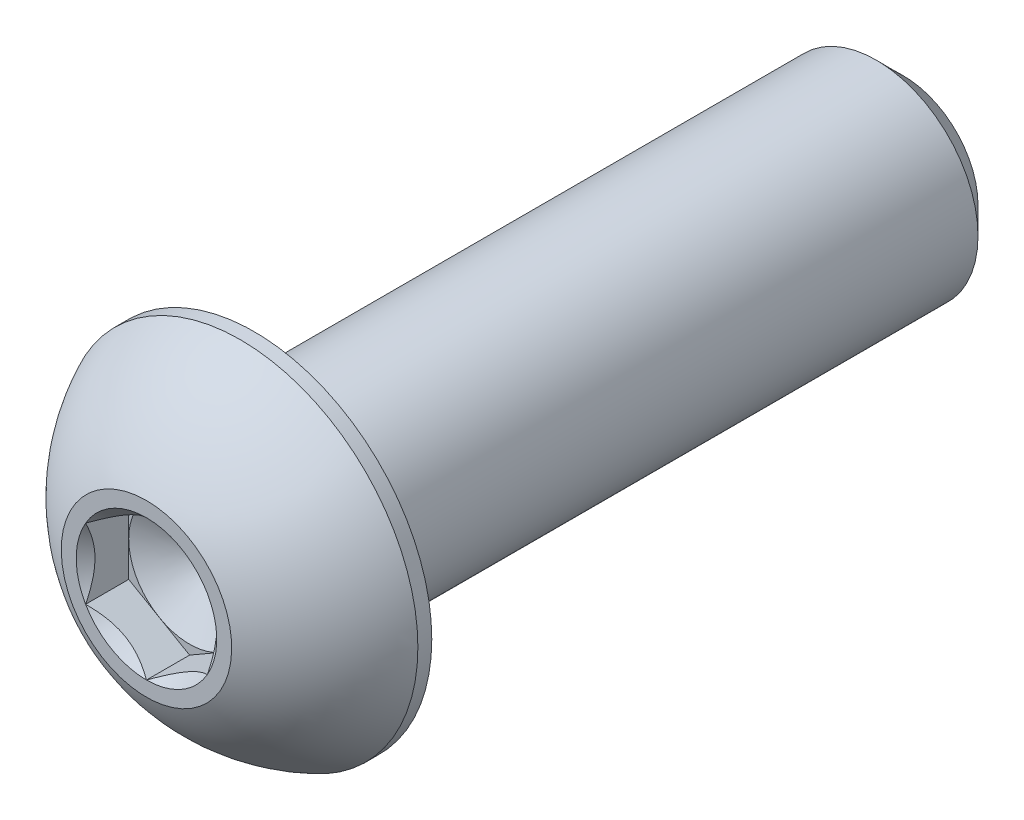
ISO-10303-21;
HEADER;
FILE_DESCRIPTION(('STEP AP214'),'2;1');
FILE_NAME('part.step','',(''),(''),'','','');
FILE_SCHEMA(('AUTOMOTIVE_DESIGN { 1 0 10303 214 1 1 1 1 }'));
ENDSEC;
DATA;
#1=APPLICATION_CONTEXT('core data for automotive mechanical design processes');
#2=APPLICATION_PROTOCOL_DEFINITION('international standard','automotive_design',2000,#1);
#3=PRODUCT_CONTEXT('',#1,'mechanical');
#4=PRODUCT('Part','Part','',(#3));
#5=PRODUCT_RELATED_PRODUCT_CATEGORY('part','',(#4));
#6=PRODUCT_DEFINITION_FORMATION('','',#4);
#7=PRODUCT_DEFINITION_CONTEXT('part definition',#1,'design');
#8=PRODUCT_DEFINITION('design','',#6,#7);
#9=PRODUCT_DEFINITION_SHAPE('','',#8);
#10=(LENGTH_UNIT() NAMED_UNIT(*) SI_UNIT(.MILLI.,.METRE.));
#11=(NAMED_UNIT(*) PLANE_ANGLE_UNIT() SI_UNIT($,.RADIAN.));
#12=(NAMED_UNIT(*) SI_UNIT($,.STERADIAN.) SOLID_ANGLE_UNIT());
#13=UNCERTAINTY_MEASURE_WITH_UNIT(LENGTH_MEASURE(1.E-05),#10,'distance_accuracy_value','');
#14=(GEOMETRIC_REPRESENTATION_CONTEXT(3) GLOBAL_UNCERTAINTY_ASSIGNED_CONTEXT((#13)) GLOBAL_UNIT_ASSIGNED_CONTEXT((#10,
#11,#12)) REPRESENTATION_CONTEXT('',''));
#15=CARTESIAN_POINT('',(0.,0.,0.));
#16=DIRECTION('',(0.,0.,1.));
#17=DIRECTION('',(1.,0.,0.));
#18=AXIS2_PLACEMENT_3D('',#15,#16,#17);
#19=CARTESIAN_POINT('',(0.,2.38125,14.8082));
#20=DIRECTION('',(0.,0.,-1.));
#21=DIRECTION('',(-1.,0.,0.));
#22=AXIS2_PLACEMENT_3D('',#19,#20,#21);
#23=PLANE('',#22);
#24=CARTESIAN_POINT('',(0.,0.,14.8082));
#25=DIRECTION('',(0.,0.,1.));
#26=DIRECTION('',(1.,0.,0.));
#27=AXIS2_PLACEMENT_3D('',#24,#25,#26);
#28=CIRCLE('',#27,3.33375);
#29=CARTESIAN_POINT('',(0.,3.33375,14.8082));
#30=VERTEX_POINT('',#29);
#31=EDGE_CURVE('E187',#30,#30,#28,.T.);
#32=ORIENTED_EDGE('',*,*,#31,.T.);
#33=EDGE_LOOP('',(#32));
#34=FACE_BOUND('',#33,.T.);
#35=CARTESIAN_POINT('',(0.,0.,14.8082));
#36=DIRECTION('',(0.,0.,1.));
#37=DIRECTION('',(1.,0.,0.));
#38=AXIS2_PLACEMENT_3D('',#35,#36,#37);
#39=CIRCLE('',#38,2.74963065701559);
#40=CARTESIAN_POINT('',(0.,2.74963065701559,14.8082));
#41=VERTEX_POINT('',#40);
#42=CARTESIAN_POINT('',(-2.38125,1.3748153285078,14.8082));
#43=VERTEX_POINT('',#42);
#44=EDGE_CURVE('E132',#41,#43,#39,.T.);
#45=ORIENTED_EDGE('',*,*,#44,.F.);
#46=CARTESIAN_POINT('',(0.,0.,14.8082));
#47=DIRECTION('',(0.,0.,1.));
#48=DIRECTION('',(1.,0.,0.));
#49=AXIS2_PLACEMENT_3D('',#46,#47,#48);
#50=CIRCLE('',#49,2.74963065701559);
#51=CARTESIAN_POINT('',(2.38125,1.37481532850779,14.8082));
#52=VERTEX_POINT('',#51);
#53=EDGE_CURVE('E112',#52,#41,#50,.T.);
#54=ORIENTED_EDGE('',*,*,#53,.F.);
#55=CARTESIAN_POINT('',(0.,0.,14.8082));
#56=DIRECTION('',(0.,0.,1.));
#57=DIRECTION('',(1.,0.,0.));
#58=AXIS2_PLACEMENT_3D('',#55,#56,#57);
#59=CIRCLE('',#58,2.74963065701559);
#60=CARTESIAN_POINT('',(2.38125,-1.37481532850779,14.8082));
#61=VERTEX_POINT('',#60);
#62=EDGE_CURVE('E130',#61,#52,#59,.T.);
#63=ORIENTED_EDGE('',*,*,#62,.F.);
#64=CARTESIAN_POINT('',(0.,0.,14.8082));
#65=DIRECTION('',(0.,0.,1.));
#66=DIRECTION('',(1.,0.,0.));
#67=AXIS2_PLACEMENT_3D('',#64,#65,#66);
#68=CIRCLE('',#67,2.74963065701559);
#69=CARTESIAN_POINT('',(0.,-2.74963065701559,14.8082));
#70=VERTEX_POINT('',#69);
#71=EDGE_CURVE('E153',#70,#61,#68,.T.);
#72=ORIENTED_EDGE('',*,*,#71,.F.);
#73=CARTESIAN_POINT('',(0.,0.,14.8082));
#74=DIRECTION('',(0.,0.,1.));
#75=DIRECTION('',(1.,0.,0.));
#76=AXIS2_PLACEMENT_3D('',#73,#74,#75);
#77=CIRCLE('',#76,2.74963065701559);
#78=CARTESIAN_POINT('',(-2.38125,-1.3748153285078,14.8082));
#79=VERTEX_POINT('',#78);
#80=EDGE_CURVE('E445',#79,#70,#77,.T.);
#81=ORIENTED_EDGE('',*,*,#80,.F.);
#82=CARTESIAN_POINT('',(0.,0.,14.8082));
#83=DIRECTION('',(0.,0.,1.));
#84=DIRECTION('',(1.,0.,0.));
#85=AXIS2_PLACEMENT_3D('',#82,#83,#84);
#86=CIRCLE('',#85,2.74963065701559);
#87=EDGE_CURVE('E451',#43,#79,#86,.T.);
#88=ORIENTED_EDGE('',*,*,#87,.F.);
#89=EDGE_LOOP('',(#45,#54,#63,#72,#81,#88));
#90=FACE_BOUND('',#89,.T.);
#91=ADVANCED_FACE('F41',(#34,#90),#23,.F.);
#92=CARTESIAN_POINT('',(0.,0.,-14.8082));
#93=DIRECTION('',(0.,0.,1.));
#94=DIRECTION('',(1.,0.,0.));
#95=AXIS2_PLACEMENT_3D('',#92,#93,#94);
#96=CONICAL_SURFACE('',#95,2.91676666666666,0.785398163397445);
#97=CARTESIAN_POINT('',(0.,0.,-13.7498666666667));
#98=DIRECTION('',(0.,0.,1.));
#99=DIRECTION('',(1.,0.,0.));
#100=AXIS2_PLACEMENT_3D('',#97,#98,#99);
#101=CIRCLE('',#100,3.9751);
#102=CARTESIAN_POINT('',(3.9751,0.,-13.7498666666667));
#103=VERTEX_POINT('',#102);
#104=EDGE_CURVE('E11',#103,#103,#101,.T.);
#105=ORIENTED_EDGE('',*,*,#104,.F.);
#106=EDGE_LOOP('',(#105));
#107=FACE_BOUND('',#106,.T.);
#108=CARTESIAN_POINT('',(0.,0.,-14.8082));
#109=DIRECTION('',(0.,0.,1.));
#110=DIRECTION('',(1.,0.,0.));
#111=AXIS2_PLACEMENT_3D('',#108,#109,#110);
#112=CIRCLE('',#111,2.91676666666666);
#113=CARTESIAN_POINT('',(2.91676666666666,0.,-14.8082));
#114=VERTEX_POINT('',#113);
#115=EDGE_CURVE('E183',#114,#114,#112,.T.);
#116=ORIENTED_EDGE('',*,*,#115,.T.);
#117=EDGE_LOOP('',(#116));
#118=FACE_BOUND('',#117,.T.);
#119=ADVANCED_FACE('F43',(#107,#118),#96,.T.);
#120=CARTESIAN_POINT('',(0.,0.,14.8082));
#121=DIRECTION('',(0.,0.,1.));
#122=DIRECTION('',(1.,0.,0.));
#123=AXIS2_PLACEMENT_3D('',#120,#121,#122);
#124=CYLINDRICAL_SURFACE('',#123,3.9751);
#125=CARTESIAN_POINT('',(0.,0.,10.5918));
#126=DIRECTION('',(0.,0.,1.));
#127=DIRECTION('',(1.,0.,0.));
#128=AXIS2_PLACEMENT_3D('',#125,#126,#127);
#129=CIRCLE('',#128,3.9751);
#130=CARTESIAN_POINT('',(3.9751,0.,10.5918));
#131=VERTEX_POINT('',#130);
#132=EDGE_CURVE('E49',#131,#131,#129,.T.);
#133=ORIENTED_EDGE('',*,*,#132,.F.);
#134=EDGE_LOOP('',(#133));
#135=FACE_BOUND('',#134,.T.);
#136=ORIENTED_EDGE('',*,*,#104,.T.);
#137=EDGE_LOOP('',(#136));
#138=FACE_BOUND('',#137,.T.);
#139=ADVANCED_FACE('F206',(#135,#138),#124,.T.);
#140=CARTESIAN_POINT('',(0.,6.9469,10.5918));
#141=DIRECTION('',(0.,0.,1.));
#142=DIRECTION('',(1.,0.,0.));
#143=AXIS2_PLACEMENT_3D('',#140,#141,#142);
#144=PLANE('',#143);
#145=CARTESIAN_POINT('',(0.,0.,10.5918));
#146=DIRECTION('',(0.,0.,1.));
#147=DIRECTION('',(1.,0.,0.));
#148=AXIS2_PLACEMENT_3D('',#145,#146,#147);
#149=CIRCLE('',#148,6.9469);
#150=CARTESIAN_POINT('',(6.9469,0.,10.5918));
#151=VERTEX_POINT('',#150);
#152=EDGE_CURVE('E197',#151,#151,#149,.T.);
#153=ORIENTED_EDGE('',*,*,#152,.F.);
#154=EDGE_LOOP('',(#153));
#155=FACE_BOUND('',#154,.T.);
#156=ORIENTED_EDGE('',*,*,#132,.T.);
#157=EDGE_LOOP('',(#156));
#158=FACE_BOUND('',#157,.T.);
#159=ADVANCED_FACE('F210',(#155,#158),#144,.F.);
#160=CARTESIAN_POINT('',(0.,0.,14.8082));
#161=DIRECTION('',(0.,0.,1.));
#162=DIRECTION('',(1.,0.,0.));
#163=AXIS2_PLACEMENT_3D('',#160,#161,#162);
#164=CYLINDRICAL_SURFACE('',#163,6.9469);
#165=CARTESIAN_POINT('',(0.,0.,11.1360857142857));
#166=DIRECTION('',(0.,0.,1.));
#167=DIRECTION('',(1.,0.,0.));
#168=AXIS2_PLACEMENT_3D('',#165,#166,#167);
#169=CIRCLE('',#168,6.9469);
#170=CARTESIAN_POINT('',(0.,6.9469,11.1360857142857));
#171=VERTEX_POINT('',#170);
#172=EDGE_CURVE('E194',#171,#171,#169,.T.);
#173=ORIENTED_EDGE('',*,*,#172,.F.);
#174=EDGE_LOOP('',(#173));
#175=FACE_BOUND('',#174,.T.);
#176=ORIENTED_EDGE('',*,*,#152,.T.);
#177=EDGE_LOOP('',(#176));
#178=FACE_BOUND('',#177,.T.);
#179=ADVANCED_FACE('F230',(#175,#178),#164,.T.);
#180=CARTESIAN_POINT('',(0.,0.,7.91435766074957));
#181=DIRECTION('',(0.,0.,1.));
#182=DIRECTION('',(0.,1.,0.));
#183=AXIS2_PLACEMENT_3D('',#180,#181,#182);
#184=SPHERICAL_SURFACE('',#183,7.65760741099606);
#185=CARTESIAN_POINT('',(0.,3.33375,14.8082));
#186=CARTESIAN_POINT('',(0.,3.38302135029023,14.784373284169));
#187=CARTESIAN_POINT('',(0.,3.43203717403164,14.7600181747289));
#188=CARTESIAN_POINT('',(0.,3.52953542836091,14.7102627440683));
#189=CARTESIAN_POINT('',(0.,3.57801785894876,14.6848624228478));
#190=CARTESIAN_POINT('',(0.,3.67442698691497,14.6330281440646));
#191=CARTESIAN_POINT('',(0.,3.72235368429333,14.6065941865018));
#192=CARTESIAN_POINT('',(0.,3.817629326969,14.5527048144032));
#193=CARTESIAN_POINT('',(0.,3.86497827226632,14.5252493998673));
#194=CARTESIAN_POINT('',(0.,3.95907663990594,14.4693297282752));
#195=CARTESIAN_POINT('',(0.,4.00582606224825,14.4408654712189));
#196=CARTESIAN_POINT('',(0.,4.09870389343264,14.3829412020653));
#197=CARTESIAN_POINT('',(0.,4.14483230227471,14.353481189968));
#198=CARTESIAN_POINT('',(0.,4.23644690014034,14.2935789535014));
#199=CARTESIAN_POINT('',(0.,4.2819330891639,14.263136729132));
#200=CARTESIAN_POINT('',(0.,4.37224233665281,14.2012840630941));
#201=CARTESIAN_POINT('',(0.,4.41706539511816,14.1698736214255));
#202=CARTESIAN_POINT('',(0.,4.50602777551311,14.1060989606913));
#203=CARTESIAN_POINT('',(0.,4.55016709744273,14.0737347416256));
#204=CARTESIAN_POINT('',(0.,4.63774171313888,14.0080674045151));
#205=CARTESIAN_POINT('',(0.,4.68117700690542,13.9747642864702));
#206=CARTESIAN_POINT('',(0.,4.76732359829586,13.9072344614351));
#207=CARTESIAN_POINT('',(0.,4.81003489591976,13.873007754445));
#208=CARTESIAN_POINT('',(0.,4.89471385988101,13.8036464861468));
#209=CARTESIAN_POINT('',(0.,4.93668152621836,13.7685119248389));
#210=CARTESIAN_POINT('',(0.,5.01985393432271,13.6973510998887));
#211=CARTESIAN_POINT('',(0.,5.0610586760897,13.6613248362464));
#212=CARTESIAN_POINT('',(0.,5.14268629249963,13.5883971685427));
#213=CARTESIAN_POINT('',(0.,5.18310916714257,13.5514957644813));
#214=CARTESIAN_POINT('',(0.,5.26315446618894,13.4768347801719));
#215=CARTESIAN_POINT('',(0.,5.30277689059236,13.4390751999239));
#216=CARTESIAN_POINT('',(0.,5.38120307402546,13.3627152219932));
#217=CARTESIAN_POINT('',(0.,5.42000683305513,13.3241148243103));
#218=CARTESIAN_POINT('',(0.,5.49677784696155,13.2460909568001));
#219=CARTESIAN_POINT('',(0.,5.53474510183829,13.2066674869727));
#220=CARTESIAN_POINT('',(0.,5.60982565321553,13.1270155988447));
#221=CARTESIAN_POINT('',(0.,5.64693894971602,13.086787180544));
#222=CARTESIAN_POINT('',(0.,5.72029452269731,13.0055438891899));
#223=CARTESIAN_POINT('',(0.,5.75653679917811,12.9645290161364));
#224=CARTESIAN_POINT('',(0.,5.82813367089999,12.8817316705442));
#225=CARTESIAN_POINT('',(0.,5.86348826614107,12.8399491980055));
#226=CARTESIAN_POINT('',(0.,5.93329352224632,12.7556358615898));
#227=CARTESIAN_POINT('',(0.,5.96774418311049,12.7131049977128));
#228=CARTESIAN_POINT('',(0.,6.03572573287969,12.6273144308161));
#229=CARTESIAN_POINT('',(0.,6.06925662178472,12.5840547277965));
#230=CARTESIAN_POINT('',(0.,6.13538321288805,12.4968263698702));
#231=CARTESIAN_POINT('',(0.,6.16797891508636,12.4528577149636));
#232=CARTESIAN_POINT('',(0.,6.23222014795407,12.3642316664386));
#233=CARTESIAN_POINT('',(0.,6.26386567862348,12.3195742728202));
#234=CARTESIAN_POINT('',(0.,6.32619202040916,12.2295912766658));
#235=CARTESIAN_POINT('',(0.,6.35687283152543,12.1842656741299));
#236=CARTESIAN_POINT('',(0.,6.41725562972736,12.0929670971458));
#237=CARTESIAN_POINT('',(0.,6.44695761681303,12.0469941226977));
#238=CARTESIAN_POINT('',(0.,6.50536911227987,11.9544219364152));
#239=CARTESIAN_POINT('',(0.,6.53407862066105,11.9078227245809));
#240=CARTESIAN_POINT('',(0.,6.59049196097422,11.8140194862722));
#241=CARTESIAN_POINT('',(0.,6.61819579290623,11.7668154597978));
#242=CARTESIAN_POINT('',(0.,6.67258504240674,11.6718242917758));
#243=CARTESIAN_POINT('',(0.,6.69927045997525,11.6240371502281));
#244=CARTESIAN_POINT('',(0.,6.75161062033667,11.5279017242615));
#245=CARTESIAN_POINT('',(0.,6.77726536312958,11.4795534398425));
#246=CARTESIAN_POINT('',(0.,6.82753235256829,11.3823179412581));
#247=CARTESIAN_POINT('',(0.,6.85214459921409,11.3334307270927));
#248=CARTESIAN_POINT('',(0.,6.90031538403797,11.2351398935073));
#249=CARTESIAN_POINT('',(0.,6.92387392221606,11.1857362740872));
#250=CARTESIAN_POINT('',(0.,6.9469,11.1360857142857));
#251=B_SPLINE_CURVE_WITH_KNOTS('',3,(#185,#186,#187,#188,#189,#190,#191,#192,#193,#194,#195,
#196,#197,#198,#199,#200,#201,#202,#203,#204,#205,#206,#207,#208,#209,#210,#211,#212,#213,#214,
#215,#216,#217,#218,#219,#220,#221,#222,#223,#224,#225,#226,#227,#228,#229,#230,#231,#232,#233,
#234,#235,#236,#237,#238,#239,#240,#241,#242,#243,#244,#245,#246,#247,#248,#249,#250),
.UNSPECIFIED.,.F.,.F.,(4,2,2,2,2,2,2,2,2,2,2,2,2,2,2,2,2,2,2,2,2,2,2,2,2,2,2,2,2,2,2,2,4),(0.,
0.164186998091728,0.328373996183455,0.492560994275183,0.65674799236691,0.820934990458635,
0.985121988550365,1.14930898664209,1.31349598473382,1.47768298282555,1.64186998091728,
1.806056979009,1.97024397710073,2.13443097519246,2.29861797328418,2.46280497137591,
2.62699196946764,2.79117896755937,2.9553659656511,3.11955296374282,3.28373996183455,
3.44792695992628,3.61211395801801,3.77630095610973,3.94048795420146,4.10467495229319,
4.26886195038492,4.43304894847664,4.59723594656837,4.7614229446601,4.92560994275183,
5.08979694084355,5.25398393893528),.UNSPECIFIED.);
#252=EDGE_CURVE('BSEAM218',#30,#171,#251,.T.);
#253=ORIENTED_EDGE('',*,*,#31,.F.);
#254=ORIENTED_EDGE('',*,*,#172,.T.);
#255=ORIENTED_EDGE('',*,*,#252,.T.);
#256=ORIENTED_EDGE('',*,*,#252,.F.);
#257=EDGE_LOOP('',(#253,#255,#254,#256));
#258=FACE_BOUND('',#257,.T.);
#259=ADVANCED_FACE('F218',(#258),#184,.T.);
#260=CARTESIAN_POINT('',(0.,2.91676666666666,-14.8082));
#261=DIRECTION('',(0.,0.,1.));
#262=DIRECTION('',(1.,0.,0.));
#263=AXIS2_PLACEMENT_3D('',#260,#261,#262);
#264=PLANE('',#263);
#265=ORIENTED_EDGE('',*,*,#115,.F.);
#266=EDGE_LOOP('',(#265));
#267=FACE_BOUND('',#266,.T.);
#268=ADVANCED_FACE('F219',(#267),#264,.F.);
#269=CARTESIAN_POINT('',(2.38125,1.3748153285078,14.8082));
#270=DIRECTION('',(-0.499999999999999,-0.866025403784439,0.));
#271=DIRECTION('',(0.866025403784439,-0.499999999999999,0.));
#272=AXIS2_PLACEMENT_3D('',#269,#270,#271);
#273=PLANE('',#272);
#274=CARTESIAN_POINT('',(2.38145,1.37469985845396,14.8083154773272));
#275=CARTESIAN_POINT('',(2.29959321762095,1.4219598937955,14.7610948967095));
#276=CARTESIAN_POINT('',(2.21636766622824,1.47001018829554,14.7166475752929));
#277=CARTESIAN_POINT('',(2.04666151916196,1.56799007798739,14.6352654569856));
#278=CARTESIAN_POINT('',(1.9601647826469,1.61792899209838,14.5983759430951));
#279=CARTESIAN_POINT('',(1.78574822599096,1.71862843803482,14.5351834131659));
#280=CARTESIAN_POINT('',(1.69787282881932,1.76936332224701,14.5087215587295));
#281=CARTESIAN_POINT('',(1.52018740592912,1.87195004898374,14.4679515156161));
#282=CARTESIAN_POINT('',(1.43038280881413,1.92379875730254,14.4536128915305));
#283=CARTESIAN_POINT('',(1.27561039686966,2.01315665100181,14.4406757847701));
#284=CARTESIAN_POINT('',(1.21084255103038,2.05055038423195,14.4387606046532));
#285=CARTESIAN_POINT('',(1.08141272066442,2.1252767316349,14.4419866227677));
#286=CARTESIAN_POINT('',(1.01675078120664,2.16260931978718,14.4471302948571));
#287=CARTESIAN_POINT('',(0.888037451422601,2.23692199538628,14.4641813108716));
#288=CARTESIAN_POINT('',(0.823986825765144,2.27390164135138,14.4760962213493));
#289=CARTESIAN_POINT('',(0.696993161094725,2.34722146783422,14.506035672352));
#290=CARTESIAN_POINT('',(0.634050037564173,2.38356169714822,14.5240597445184));
#291=CARTESIAN_POINT('',(0.472823849267816,2.47664568036154,14.5775688075524));
#292=CARTESIAN_POINT('',(0.375540508712158,2.53281224321902,14.6170874208722));
#293=CARTESIAN_POINT('',(0.232493937374429,2.61540021968751,14.6838003435508));
#294=CARTESIAN_POINT('',(0.185353711056034,2.64261664204209,14.7072402091113));
#295=CARTESIAN_POINT('',(0.0919464736333602,2.69654533571233,14.7562566766595));
#296=CARTESIAN_POINT('',(0.0456789475031768,2.72325790437833,14.7818319667669));
#297=CARTESIAN_POINT('',(-0.000200000000001534,2.74974612706943,14.8083154773272));
#298=B_SPLINE_CURVE_WITH_KNOTS('',3,(#274,#275,#276,#277,#278,#279,#280,#281,#282,#283,#284,
#285,#286,#287,#288,#289,#290,#291,#292,#293,#294,#295,#296,#297),.UNSPECIFIED.,.F.,.F.,(4,2,2,
2,2,2,2,2,2,2,2,4),(0.,0.31719661061195,0.636241461041221,0.950218950629225,1.26340583824126,
1.48752413747844,1.71172100167747,1.93616888974082,2.16059957440836,2.51709639744763,
2.69486147369099,2.87251813383154),.UNSPECIFIED.);
#299=EDGE_CURVE('E115',#52,#41,#298,.T.);
#300=ORIENTED_EDGE('',*,*,#299,.T.);
#301=DIRECTION('',(0.,0.,-1.));
#302=VECTOR('',#301,1.);
#303=CARTESIAN_POINT('',(0.,2.74963065701559,14.8082));
#304=LINE('',#303,#302);
#305=CARTESIAN_POINT('',(0.,2.74963065701559,13.12164));
#306=VERTEX_POINT('',#305);
#307=EDGE_CURVE('E176',#41,#306,#304,.T.);
#308=ORIENTED_EDGE('',*,*,#307,.T.);
#309=DIRECTION('',(-0.866025403784439,0.499999999999999,0.));
#310=VECTOR('',#309,1.);
#311=CARTESIAN_POINT('',(2.38125,1.3748153285078,13.12164));
#312=LINE('',#311,#310);
#313=CARTESIAN_POINT('',(1.190625,2.0622229927617,13.12164));
#314=VERTEX_POINT('',#313);
#315=EDGE_CURVE('E485',#314,#306,#312,.T.);
#316=ORIENTED_EDGE('',*,*,#315,.F.);
#317=CARTESIAN_POINT('',(2.38125,1.3748153285078,13.12164));
#318=VERTEX_POINT('',#317);
#319=EDGE_CURVE('E60',#318,#314,#312,.T.);
#320=ORIENTED_EDGE('',*,*,#319,.F.);
#321=DIRECTION('',(0.,0.,-1.));
#322=VECTOR('',#321,1.);
#323=CARTESIAN_POINT('',(2.38125,1.3748153285078,14.8082));
#324=LINE('',#323,#322);
#325=EDGE_CURVE('E149',#52,#318,#324,.T.);
#326=ORIENTED_EDGE('',*,*,#325,.F.);
#327=EDGE_LOOP('',(#300,#308,#316,#320,#326));
#328=FACE_BOUND('',#327,.T.);
#329=ADVANCED_FACE('F151',(#328),#273,.T.);
#330=CARTESIAN_POINT('',(0.,2.74963065701559,14.8082));
#331=DIRECTION('',(0.5,-0.866025403784438,0.));
#332=DIRECTION('',(0.866025403784439,0.5,0.));
#333=AXIS2_PLACEMENT_3D('',#330,#331,#332);
#334=PLANE('',#333);
#335=CARTESIAN_POINT('',(0.000199999999998581,2.74974612706943,14.8083154773272));
#336=CARTESIAN_POINT('',(-0.0816567823790514,2.70248609172789,14.7610948967095));
#337=CARTESIAN_POINT('',(-0.164882333771761,2.65443579722785,14.7166475752929));
#338=CARTESIAN_POINT('',(-0.33458848083804,2.556455907536,14.6352654569856));
#339=CARTESIAN_POINT('',(-0.421085217353102,2.50651699342501,14.5983759430951));
#340=CARTESIAN_POINT('',(-0.595501774009042,2.40581754748857,14.5351834131659));
#341=CARTESIAN_POINT('',(-0.683377171180674,2.35508266327639,14.5087215587295));
#342=CARTESIAN_POINT('',(-0.861062594070875,2.25249593653966,14.4679515156161));
#343=CARTESIAN_POINT('',(-0.95086719118587,2.20064722822085,14.4536128915305));
#344=CARTESIAN_POINT('',(-1.10563960313034,2.11128933452158,14.4406757847701));
#345=CARTESIAN_POINT('',(-1.17040744896962,2.07389560129144,14.4387606046532));
#346=CARTESIAN_POINT('',(-1.29983727933557,1.99916925388849,14.4419866227677));
#347=CARTESIAN_POINT('',(-1.36449921879335,1.96183666573622,14.4471302948571));
#348=CARTESIAN_POINT('',(-1.4932125485774,1.88752399013711,14.4641813108716));
#349=CARTESIAN_POINT('',(-1.55726317423485,1.85054434417201,14.4760962213493));
#350=CARTESIAN_POINT('',(-1.68425683890527,1.77722451768917,14.506035672352));
#351=CARTESIAN_POINT('',(-1.74719996243582,1.74088428837517,14.5240597445184));
#352=CARTESIAN_POINT('',(-1.90842615073218,1.64780030516185,14.5775688075524));
#353=CARTESIAN_POINT('',(-2.00570949128784,1.59163374230437,14.6170874208722));
#354=CARTESIAN_POINT('',(-2.14875606262557,1.50904576583588,14.6838003435508));
#355=CARTESIAN_POINT('',(-2.19589628894397,1.48182934348129,14.7072402091113));
#356=CARTESIAN_POINT('',(-2.28930352636664,1.42790064981105,14.7562566766595));
#357=CARTESIAN_POINT('',(-2.33557105249682,1.40118808114505,14.7818319667669));
#358=CARTESIAN_POINT('',(-2.38145,1.37469985845396,14.8083154773272));
#359=B_SPLINE_CURVE_WITH_KNOTS('',3,(#335,#336,#337,#338,#339,#340,#341,#342,#343,#344,#345,
#346,#347,#348,#349,#350,#351,#352,#353,#354,#355,#356,#357,#358),.UNSPECIFIED.,.F.,.F.,(4,2,2,
2,2,2,2,2,2,2,2,4),(0.,0.317196610611948,0.636241461041217,0.95021895062922,1.26340583824126,
1.48752413747844,1.71172100167747,1.93616888974082,2.16059957440836,2.51709639744763,
2.69486147369099,2.87251813383154),.UNSPECIFIED.);
#360=EDGE_CURVE('E466',#41,#43,#359,.T.);
#361=ORIENTED_EDGE('',*,*,#360,.T.);
#362=DIRECTION('',(0.,0.,-1.));
#363=VECTOR('',#362,1.);
#364=CARTESIAN_POINT('',(-2.38125,1.3748153285078,14.8082));
#365=LINE('',#364,#363);
#366=CARTESIAN_POINT('',(-2.38125,1.3748153285078,13.12164));
#367=VERTEX_POINT('',#366);
#368=EDGE_CURVE('E173',#43,#367,#365,.T.);
#369=ORIENTED_EDGE('',*,*,#368,.T.);
#370=DIRECTION('',(-0.866025403784438,-0.5,0.));
#371=VECTOR('',#370,1.);
#372=CARTESIAN_POINT('',(0.,2.74963065701559,13.12164));
#373=LINE('',#372,#371);
#374=CARTESIAN_POINT('',(-1.190625,2.06222299276169,13.12164));
#375=VERTEX_POINT('',#374);
#376=EDGE_CURVE('E490',#375,#367,#373,.T.);
#377=ORIENTED_EDGE('',*,*,#376,.F.);
#378=EDGE_CURVE('E486',#306,#375,#373,.T.);
#379=ORIENTED_EDGE('',*,*,#378,.F.);
#380=ORIENTED_EDGE('',*,*,#307,.F.);
#381=EDGE_LOOP('',(#361,#369,#377,#379,#380));
#382=FACE_BOUND('',#381,.T.);
#383=ADVANCED_FACE('F222',(#382),#334,.T.);
#384=CARTESIAN_POINT('',(-2.38125,1.3748153285078,14.8082));
#385=DIRECTION('',(1.,0.,0.));
#386=DIRECTION('',(0.,0.,-1.));
#387=AXIS2_PLACEMENT_3D('',#384,#385,#386);
#388=PLANE('',#387);
#389=CARTESIAN_POINT('',(-2.38125,-2.68093697563405,15.6443432663965));
#390=CARTESIAN_POINT('',(-2.38125,-2.61537673823883,15.5953377465174));
#391=CARTESIAN_POINT('',(-2.38125,-2.5494428959396,15.5468241515259));
#392=CARTESIAN_POINT('',(-2.38125,-2.41668286712078,15.450998463343));
#393=CARTESIAN_POINT('',(-2.38125,-2.34985645441489,15.4036866838688));
#394=CARTESIAN_POINT('',(-2.38125,-2.21467778506723,15.3101465530956));
#395=CARTESIAN_POINT('',(-2.38125,-2.14631771455877,15.263929448702));
#396=CARTESIAN_POINT('',(-2.38125,-2.00842861240695,15.1732822820154));
#397=CARTESIAN_POINT('',(-2.38125,-1.93889966505844,15.1288520916344));
#398=CARTESIAN_POINT('',(-2.38125,-1.79468056782077,15.0398168397088));
#399=CARTESIAN_POINT('',(-2.38125,-1.7199148963968,14.9953327509229));
#400=CARTESIAN_POINT('',(-2.38125,-1.56866640609358,14.9093937948604));
#401=CARTESIAN_POINT('',(-2.38125,-1.4921832926984,14.8679394524072));
#402=CARTESIAN_POINT('',(-2.38125,-1.26025763131786,14.7494620510276));
#403=CARTESIAN_POINT('',(-2.38125,-1.10179241401632,14.6779747218281));
#404=CARTESIAN_POINT('',(-2.38125,-0.863378822320742,14.5905371160492));
#405=CARTESIAN_POINT('',(-2.38125,-0.786812117689916,14.5653432254707));
#406=CARTESIAN_POINT('',(-2.38125,-0.631880652104271,14.521110848047));
#407=CARTESIAN_POINT('',(-2.38125,-0.553515762563794,14.502072802876));
#408=CARTESIAN_POINT('',(-2.38125,-0.396740444727931,14.4714422086397));
#409=CARTESIAN_POINT('',(-2.38125,-0.318354592421681,14.4597257304419));
#410=CARTESIAN_POINT('',(-2.38125,-0.160811391513107,14.4439572505446));
#411=CARTESIAN_POINT('',(-2.38125,-0.081654165488202,14.4399040504268));
#412=CARTESIAN_POINT('',(-2.38125,0.074060292385675,14.4397399931148));
#413=CARTESIAN_POINT('',(-2.38125,0.150617362449071,14.4433721582242));
#414=CARTESIAN_POINT('',(-2.38125,0.303045058644073,14.4578250392574));
#415=CARTESIAN_POINT('',(-2.38125,0.378915615534023,14.4686464722762));
#416=CARTESIAN_POINT('',(-2.38125,0.530705497402317,14.4970811808727));
#417=CARTESIAN_POINT('',(-2.38125,0.606603253729553,14.5148079792297));
#418=CARTESIAN_POINT('',(-2.38125,0.7567446999479,14.5561296417724));
#419=CARTESIAN_POINT('',(-2.38125,0.830988547951422,14.5797239423834));
#420=CARTESIAN_POINT('',(-2.38125,1.06763086976207,14.6637213761345));
#421=CARTESIAN_POINT('',(-2.38125,1.22660579709034,14.7338089551137));
#422=CARTESIAN_POINT('',(-2.38125,1.45921559038166,14.8505529104409));
#423=CARTESIAN_POINT('',(-2.38125,1.53592336227363,14.8914960087655));
#424=CARTESIAN_POINT('',(-2.38125,1.68759115763186,14.9765080130968));
#425=CARTESIAN_POINT('',(-2.38125,1.76255149716754,15.0205763479007));
#426=CARTESIAN_POINT('',(-2.38125,1.90722078640504,15.1089350758827));
#427=CARTESIAN_POINT('',(-2.38125,1.9770047991093,15.153103977698));
#428=CARTESIAN_POINT('',(-2.38125,2.1153770860433,15.2432859170887));
#429=CARTESIAN_POINT('',(-2.38125,2.18396526865549,15.2892990950785));
#430=CARTESIAN_POINT('',(-2.38125,2.31954185261313,15.3824549535719));
#431=CARTESIAN_POINT('',(-2.38125,2.38653874938857,15.4295853213314));
#432=CARTESIAN_POINT('',(-2.38125,2.51961928244701,15.5250816363799));
#433=CARTESIAN_POINT('',(-2.38125,2.5857031643215,15.5734472410235));
#434=CARTESIAN_POINT('',(-2.38125,2.65140534249806,15.6223176299328));
#435=B_SPLINE_CURVE_WITH_KNOTS('',3,(#389,#390,#391,#392,#393,#394,#395,#396,#397,#398,#399,
#400,#401,#402,#403,#404,#405,#406,#407,#408,#409,#410,#411,#412,#413,#414,#415,#416,#417,#418,
#419,#420,#421,#422,#423,#424,#425,#426,#427,#428,#429,#430,#431,#432,#433,#434),.UNSPECIFIED.,
.F.,.F.,(4,2,2,2,2,2,2,2,2,2,2,2,2,2,2,2,2,2,2,2,2,2,4),(0.,0.245559397749502,0.49118225005154,
0.738709851919414,0.986219678990053,1.24714085173299,1.50810711556283,2.02809815735129,
2.26971433296159,2.51134784037998,2.74877188520499,2.98615879750397,3.21573376787964,
3.44533164068965,3.67887518141291,3.9123962988927,4.43198274993457,4.69281495793137,
4.95359961558862,5.20133278619984,5.44908485401467,5.6948110258164,5.94046975988132),.UNSPECIFIED.);
#436=EDGE_CURVE('E462',#43,#79,#435,.F.);
#437=ORIENTED_EDGE('',*,*,#436,.T.);
#438=DIRECTION('',(0.,0.,-1.));
#439=VECTOR('',#438,1.);
#440=CARTESIAN_POINT('',(-2.38125,-1.3748153285078,14.8082));
#441=LINE('',#440,#439);
#442=CARTESIAN_POINT('',(-2.38125,-1.3748153285078,13.12164));
#443=VERTEX_POINT('',#442);
#444=EDGE_CURVE('E168',#79,#443,#441,.T.);
#445=ORIENTED_EDGE('',*,*,#444,.T.);
#446=DIRECTION('',(0.,-1.,0.));
#447=VECTOR('',#446,1.);
#448=CARTESIAN_POINT('',(-2.38125,1.3748153285078,13.12164));
#449=LINE('',#448,#447);
#450=CARTESIAN_POINT('',(-2.38125,0.,13.12164));
#451=VERTEX_POINT('',#450);
#452=EDGE_CURVE('E491',#451,#443,#449,.T.);
#453=ORIENTED_EDGE('',*,*,#452,.F.);
#454=EDGE_CURVE('E495',#367,#451,#449,.T.);
#455=ORIENTED_EDGE('',*,*,#454,.F.);
#456=ORIENTED_EDGE('',*,*,#368,.F.);
#457=EDGE_LOOP('',(#437,#445,#453,#455,#456));
#458=FACE_BOUND('',#457,.T.);
#459=ADVANCED_FACE('F331',(#458),#388,.T.);
#460=CARTESIAN_POINT('',(-2.38125,-1.3748153285078,14.8082));
#461=DIRECTION('',(0.499999999999999,0.866025403784439,0.));
#462=DIRECTION('',(-0.866025403784439,0.499999999999999,0.));
#463=AXIS2_PLACEMENT_3D('',#460,#461,#462);
#464=PLANE('',#463);
#465=CARTESIAN_POINT('',(-2.38145,-1.37469985845396,14.8083154773272));
#466=CARTESIAN_POINT('',(-2.29959321762095,-1.4219598937955,14.7610948967095));
#467=CARTESIAN_POINT('',(-2.21636766622824,-1.47001018829554,14.7166475752929));
#468=CARTESIAN_POINT('',(-2.04666151916196,-1.56799007798739,14.6352654569856));
#469=CARTESIAN_POINT('',(-1.9601647826469,-1.61792899209838,14.5983759430951));
#470=CARTESIAN_POINT('',(-1.78574822599096,-1.71862843803482,14.5351834131659));
#471=CARTESIAN_POINT('',(-1.69787282881932,-1.76936332224701,14.5087215587295));
#472=CARTESIAN_POINT('',(-1.52018740592912,-1.87195004898373,14.4679515156161));
#473=CARTESIAN_POINT('',(-1.43038280881413,-1.92379875730254,14.4536128915305));
#474=CARTESIAN_POINT('',(-1.27561039686966,-2.01315665100181,14.4406757847701));
#475=CARTESIAN_POINT('',(-1.21084255103038,-2.05055038423195,14.4387606046532));
#476=CARTESIAN_POINT('',(-1.08141272066443,-2.1252767316349,14.4419866227677));
#477=CARTESIAN_POINT('',(-1.01675078120664,-2.16260931978717,14.4471302948571));
#478=CARTESIAN_POINT('',(-0.888037451422603,-2.23692199538628,14.4641813108716));
#479=CARTESIAN_POINT('',(-0.823986825765146,-2.27390164135138,14.4760962213493));
#480=CARTESIAN_POINT('',(-0.696993161094727,-2.34722146783422,14.506035672352));
#481=CARTESIAN_POINT('',(-0.634050037564176,-2.38356169714822,14.5240597445184));
#482=CARTESIAN_POINT('',(-0.472823849267818,-2.47664568036154,14.5775688075524));
#483=CARTESIAN_POINT('',(-0.37554050871216,-2.53281224321902,14.6170874208722));
#484=CARTESIAN_POINT('',(-0.23249393737443,-2.61540021968751,14.6838003435508));
#485=CARTESIAN_POINT('',(-0.185353711056035,-2.64261664204209,14.7072402091113));
#486=CARTESIAN_POINT('',(-0.0919464736333604,-2.69654533571233,14.7562566766595));
#487=CARTESIAN_POINT('',(-0.0456789475031769,-2.72325790437833,14.7818319667669));
#488=CARTESIAN_POINT('',(0.000200000000001864,-2.74974612706943,14.8083154773272));
#489=B_SPLINE_CURVE_WITH_KNOTS('',3,(#465,#466,#467,#468,#469,#470,#471,#472,#473,#474,#475,
#476,#477,#478,#479,#480,#481,#482,#483,#484,#485,#486,#487,#488),.UNSPECIFIED.,.F.,.F.,(4,2,2,
2,2,2,2,2,2,2,2,4),(0.,0.31719661061195,0.63624146104122,0.950218950629223,1.26340583824126,
1.48752413747844,1.71172100167747,1.93616888974082,2.16059957440836,2.51709639744763,
2.69486147369099,2.87251813383154),.UNSPECIFIED.);
#490=EDGE_CURVE('E443',#79,#70,#489,.T.);
#491=ORIENTED_EDGE('',*,*,#490,.T.);
#492=DIRECTION('',(0.,0.,-1.));
#493=VECTOR('',#492,1.);
#494=CARTESIAN_POINT('',(0.,-2.74963065701559,14.8082));
#495=LINE('',#494,#493);
#496=CARTESIAN_POINT('',(0.,-2.74963065701559,13.12164));
#497=VERTEX_POINT('',#496);
#498=EDGE_CURVE('E159',#70,#497,#495,.T.);
#499=ORIENTED_EDGE('',*,*,#498,.T.);
#500=DIRECTION('',(0.866025403784439,-0.499999999999999,0.));
#501=VECTOR('',#500,1.);
#502=CARTESIAN_POINT('',(-2.38125,-1.3748153285078,13.12164));
#503=LINE('',#502,#501);
#504=CARTESIAN_POINT('',(-1.190625,-2.0622229927617,13.12164));
#505=VERTEX_POINT('',#504);
#506=EDGE_CURVE('E496',#505,#497,#503,.T.);
#507=ORIENTED_EDGE('',*,*,#506,.F.);
#508=EDGE_CURVE('E500',#443,#505,#503,.T.);
#509=ORIENTED_EDGE('',*,*,#508,.F.);
#510=ORIENTED_EDGE('',*,*,#444,.F.);
#511=EDGE_LOOP('',(#491,#499,#507,#509,#510));
#512=FACE_BOUND('',#511,.T.);
#513=ADVANCED_FACE('F345',(#512),#464,.T.);
#514=CARTESIAN_POINT('',(0.,-2.74963065701559,14.8082));
#515=DIRECTION('',(-0.5,0.866025403784438,0.));
#516=DIRECTION('',(-0.866025403784439,-0.5,0.));
#517=AXIS2_PLACEMENT_3D('',#514,#515,#516);
#518=PLANE('',#517);
#519=CARTESIAN_POINT('',(-0.000199999999997846,-2.74974612706943,14.8083154773272));
#520=CARTESIAN_POINT('',(0.0816567823790523,-2.70248609172789,14.7610948967095));
#521=CARTESIAN_POINT('',(0.164882333771762,-2.65443579722785,14.7166475752929));
#522=CARTESIAN_POINT('',(0.334588480838041,-2.556455907536,14.6352654569856));
#523=CARTESIAN_POINT('',(0.421085217353104,-2.50651699342501,14.5983759430951));
#524=CARTESIAN_POINT('',(0.595501774009043,-2.40581754748857,14.5351834131659));
#525=CARTESIAN_POINT('',(0.683377171180676,-2.35508266327639,14.5087215587295));
#526=CARTESIAN_POINT('',(0.861062594070877,-2.25249593653966,14.4679515156161));
#527=CARTESIAN_POINT('',(0.950867191185872,-2.20064722822085,14.4536128915305));
#528=CARTESIAN_POINT('',(1.10563960313034,-2.11128933452158,14.4406757847701));
#529=CARTESIAN_POINT('',(1.17040744896962,-2.07389560129144,14.4387606046532));
#530=CARTESIAN_POINT('',(1.29983727933557,-1.99916925388849,14.4419866227677));
#531=CARTESIAN_POINT('',(1.36449921879336,-1.96183666573622,14.4471302948571));
#532=CARTESIAN_POINT('',(1.4932125485774,-1.88752399013711,14.4641813108716));
#533=CARTESIAN_POINT('',(1.55726317423485,-1.85054434417201,14.4760962213493));
#534=CARTESIAN_POINT('',(1.68425683890527,-1.77722451768917,14.506035672352));
#535=CARTESIAN_POINT('',(1.74719996243582,-1.74088428837517,14.5240597445185));
#536=CARTESIAN_POINT('',(1.90842615073218,-1.64780030516185,14.5775688075524));
#537=CARTESIAN_POINT('',(2.00570949128784,-1.59163374230437,14.6170874208722));
#538=CARTESIAN_POINT('',(2.14875606262557,-1.50904576583588,14.6838003435508));
#539=CARTESIAN_POINT('',(2.19589628894397,-1.48182934348129,14.7072402091113));
#540=CARTESIAN_POINT('',(2.28930352636664,-1.42790064981105,14.7562566766595));
#541=CARTESIAN_POINT('',(2.33557105249682,-1.40118808114506,14.7818319667669));
#542=CARTESIAN_POINT('',(2.38145,-1.37469985845396,14.8083154773272));
#543=B_SPLINE_CURVE_WITH_KNOTS('',3,(#519,#520,#521,#522,#523,#524,#525,#526,#527,#528,#529,
#530,#531,#532,#533,#534,#535,#536,#537,#538,#539,#540,#541,#542),.UNSPECIFIED.,.F.,.F.,(4,2,2,
2,2,2,2,2,2,2,2,4),(0.,0.317196610611948,0.636241461041217,0.95021895062922,1.26340583824126,
1.48752413747844,1.71172100167747,1.93616888974082,2.16059957440836,2.51709639744763,
2.69486147369099,2.87251813383154),.UNSPECIFIED.);
#544=EDGE_CURVE('E431',#70,#61,#543,.T.);
#545=ORIENTED_EDGE('',*,*,#544,.T.);
#546=DIRECTION('',(0.,0.,-1.));
#547=VECTOR('',#546,1.);
#548=CARTESIAN_POINT('',(2.38125,-1.3748153285078,14.8082));
#549=LINE('',#548,#547);
#550=CARTESIAN_POINT('',(2.38125,-1.3748153285078,13.12164));
#551=VERTEX_POINT('',#550);
#552=EDGE_CURVE('E148',#61,#551,#549,.T.);
#553=ORIENTED_EDGE('',*,*,#552,.T.);
#554=DIRECTION('',(0.866025403784438,0.5,0.));
#555=VECTOR('',#554,1.);
#556=CARTESIAN_POINT('',(0.,-2.74963065701559,13.12164));
#557=LINE('',#556,#555);
#558=CARTESIAN_POINT('',(1.190625,-2.0622229927617,13.12164));
#559=VERTEX_POINT('',#558);
#560=EDGE_CURVE('E499',#559,#551,#557,.T.);
#561=ORIENTED_EDGE('',*,*,#560,.F.);
#562=EDGE_CURVE('E501',#497,#559,#557,.T.);
#563=ORIENTED_EDGE('',*,*,#562,.F.);
#564=ORIENTED_EDGE('',*,*,#498,.F.);
#565=EDGE_LOOP('',(#545,#553,#561,#563,#564));
#566=FACE_BOUND('',#565,.T.);
#567=ADVANCED_FACE('F351',(#566),#518,.T.);
#568=CARTESIAN_POINT('',(2.38125,-1.3748153285078,14.8082));
#569=DIRECTION('',(-1.,0.,0.));
#570=DIRECTION('',(0.,-1.,0.));
#571=AXIS2_PLACEMENT_3D('',#568,#569,#570);
#572=PLANE('',#571);
#573=CARTESIAN_POINT('',(2.38125,-2.68093697563405,15.6443432663965));
#574=CARTESIAN_POINT('',(2.38125,-2.61537673823883,15.5953377465174));
#575=CARTESIAN_POINT('',(2.38125,-2.5494428959396,15.5468241515259));
#576=CARTESIAN_POINT('',(2.38125,-2.41668286712078,15.450998463343));
#577=CARTESIAN_POINT('',(2.38125,-2.34985645441489,15.4036866838688));
#578=CARTESIAN_POINT('',(2.38125,-2.21467778506723,15.3101465530956));
#579=CARTESIAN_POINT('',(2.38125,-2.14631771455877,15.263929448702));
#580=CARTESIAN_POINT('',(2.38125,-2.00842861240695,15.1732822820154));
#581=CARTESIAN_POINT('',(2.38125,-1.93889966505843,15.1288520916344));
#582=CARTESIAN_POINT('',(2.38125,-1.79468056782076,15.0398168397088));
#583=CARTESIAN_POINT('',(2.38125,-1.7199148963968,14.9953327509229));
#584=CARTESIAN_POINT('',(2.38125,-1.56866640609358,14.9093937948604));
#585=CARTESIAN_POINT('',(2.38125,-1.4921832926984,14.8679394524072));
#586=CARTESIAN_POINT('',(2.38125,-1.26025763131786,14.7494620510276));
#587=CARTESIAN_POINT('',(2.38125,-1.10179241401632,14.6779747218281));
#588=CARTESIAN_POINT('',(2.38125,-0.86337882232074,14.5905371160492));
#589=CARTESIAN_POINT('',(2.38125,-0.786812117689913,14.5653432254707));
#590=CARTESIAN_POINT('',(2.38125,-0.631880652104268,14.521110848047));
#591=CARTESIAN_POINT('',(2.38125,-0.55351576256379,14.502072802876));
#592=CARTESIAN_POINT('',(2.38125,-0.396740444727927,14.4714422086397));
#593=CARTESIAN_POINT('',(2.38125,-0.318354592421678,14.4597257304419));
#594=CARTESIAN_POINT('',(2.38125,-0.160811391513103,14.4439572505446));
#595=CARTESIAN_POINT('',(2.38125,-0.0816541654881983,14.4399040504268));
#596=CARTESIAN_POINT('',(2.38125,0.0740602923856784,14.4397399931148));
#597=CARTESIAN_POINT('',(2.38125,0.150617362449074,14.4433721582242));
#598=CARTESIAN_POINT('',(2.38125,0.303045058644076,14.4578250392574));
#599=CARTESIAN_POINT('',(2.38125,0.378915615534026,14.4686464722762));
#600=CARTESIAN_POINT('',(2.38125,0.53070549740232,14.4970811808727));
#601=CARTESIAN_POINT('',(2.38125,0.606603253729556,14.5148079792297));
#602=CARTESIAN_POINT('',(2.38125,0.756744699947902,14.5561296417724));
#603=CARTESIAN_POINT('',(2.38125,0.830988547951424,14.5797239423834));
#604=CARTESIAN_POINT('',(2.38125,1.06763086976207,14.6637213761345));
#605=CARTESIAN_POINT('',(2.38125,1.22660579709035,14.7338089551137));
#606=CARTESIAN_POINT('',(2.38125,1.45921559038166,14.8505529104409));
#607=CARTESIAN_POINT('',(2.38125,1.53592336227363,14.8914960087655));
#608=CARTESIAN_POINT('',(2.38125,1.68759115763186,14.9765080130968));
#609=CARTESIAN_POINT('',(2.38125,1.76255149716754,15.0205763479007));
#610=CARTESIAN_POINT('',(2.38125,1.90722078640504,15.1089350758827));
#611=CARTESIAN_POINT('',(2.38125,1.9770047991093,15.153103977698));
#612=CARTESIAN_POINT('',(2.38125,2.1153770860433,15.2432859170887));
#613=CARTESIAN_POINT('',(2.38125,2.18396526865549,15.2892990950785));
#614=CARTESIAN_POINT('',(2.38125,2.31954185261314,15.3824549535719));
#615=CARTESIAN_POINT('',(2.38125,2.38653874938857,15.4295853213314));
#616=CARTESIAN_POINT('',(2.38125,2.51961928244702,15.5250816363799));
#617=CARTESIAN_POINT('',(2.38125,2.58570316432151,15.5734472410235));
#618=CARTESIAN_POINT('',(2.38125,2.65140534249807,15.6223176299328));
#619=B_SPLINE_CURVE_WITH_KNOTS('',3,(#573,#574,#575,#576,#577,#578,#579,#580,#581,#582,#583,
#584,#585,#586,#587,#588,#589,#590,#591,#592,#593,#594,#595,#596,#597,#598,#599,#600,#601,#602,
#603,#604,#605,#606,#607,#608,#609,#610,#611,#612,#613,#614,#615,#616,#617,#618),.UNSPECIFIED.,
.F.,.F.,(4,2,2,2,2,2,2,2,2,2,2,2,2,2,2,2,2,2,2,2,2,2,4),(0.,0.245559397749501,0.491182250051538,
0.738709851919414,0.986219678990051,1.24714085173299,1.50810711556282,2.02809815735129,
2.26971433296159,2.51134784037998,2.74877188520499,2.98615879750397,3.21573376787964,
3.44533164068965,3.67887518141291,3.91239629889269,4.43198274993457,4.69281495793137,
4.95359961558861,5.20133278619984,5.44908485401467,5.6948110258164,5.94046975988132),.UNSPECIFIED.);
#620=EDGE_CURVE('E139',#61,#52,#619,.T.);
#621=ORIENTED_EDGE('',*,*,#620,.T.);
#622=ORIENTED_EDGE('',*,*,#325,.T.);
#623=DIRECTION('',(0.,1.,0.));
#624=VECTOR('',#623,1.);
#625=CARTESIAN_POINT('',(2.38125,-1.3748153285078,13.12164));
#626=LINE('',#625,#624);
#627=CARTESIAN_POINT('',(2.38125,0.,13.12164));
#628=VERTEX_POINT('',#627);
#629=EDGE_CURVE('E164',#628,#318,#626,.T.);
#630=ORIENTED_EDGE('',*,*,#629,.F.);
#631=EDGE_CURVE('E154',#551,#628,#626,.T.);
#632=ORIENTED_EDGE('',*,*,#631,.F.);
#633=ORIENTED_EDGE('',*,*,#552,.F.);
#634=EDGE_LOOP('',(#621,#622,#630,#632,#633));
#635=FACE_BOUND('',#634,.T.);
#636=ADVANCED_FACE('F141',(#635),#572,.T.);
#637=CARTESIAN_POINT('',(0.,0.,13.12164));
#638=DIRECTION('',(0.,0.,1.));
#639=DIRECTION('',(1.,0.,0.));
#640=AXIS2_PLACEMENT_3D('',#637,#638,#639);
#641=PLANE('',#640);
#642=CARTESIAN_POINT('',(0.,0.,13.12164));
#643=DIRECTION('',(0.,0.,1.));
#644=DIRECTION('',(1.,0.,0.));
#645=AXIS2_PLACEMENT_3D('',#642,#643,#644);
#646=CIRCLE('',#645,2.38125);
#647=EDGE_CURVE('E184',#559,#628,#646,.T.);
#648=ORIENTED_EDGE('',*,*,#647,.F.);
#649=ORIENTED_EDGE('',*,*,#560,.T.);
#650=ORIENTED_EDGE('',*,*,#631,.T.);
#651=EDGE_LOOP('',(#648,#649,#650));
#652=FACE_BOUND('',#651,.T.);
#653=ADVANCED_FACE('F261',(#652),#641,.T.);
#654=EDGE_CURVE('E517',#505,#559,#646,.T.);
#655=ORIENTED_EDGE('',*,*,#654,.F.);
#656=ORIENTED_EDGE('',*,*,#506,.T.);
#657=ORIENTED_EDGE('',*,*,#562,.T.);
#658=EDGE_LOOP('',(#655,#656,#657));
#659=FACE_BOUND('',#658,.T.);
#660=ADVANCED_FACE('F268',(#659),#641,.T.);
#661=EDGE_CURVE('E524',#451,#505,#646,.T.);
#662=ORIENTED_EDGE('',*,*,#661,.F.);
#663=ORIENTED_EDGE('',*,*,#452,.T.);
#664=ORIENTED_EDGE('',*,*,#508,.T.);
#665=EDGE_LOOP('',(#662,#663,#664));
#666=FACE_BOUND('',#665,.T.);
#667=ADVANCED_FACE('F279',(#666),#641,.T.);
#668=EDGE_CURVE('E525',#375,#451,#646,.T.);
#669=ORIENTED_EDGE('',*,*,#668,.F.);
#670=ORIENTED_EDGE('',*,*,#376,.T.);
#671=ORIENTED_EDGE('',*,*,#454,.T.);
#672=EDGE_LOOP('',(#669,#670,#671));
#673=FACE_BOUND('',#672,.T.);
#674=ADVANCED_FACE('F289',(#673),#641,.T.);
#675=EDGE_CURVE('E191',#314,#375,#646,.T.);
#676=ORIENTED_EDGE('',*,*,#675,.F.);
#677=ORIENTED_EDGE('',*,*,#315,.T.);
#678=ORIENTED_EDGE('',*,*,#378,.T.);
#679=EDGE_LOOP('',(#676,#677,#678));
#680=FACE_BOUND('',#679,.T.);
#681=ADVANCED_FACE('F299',(#680),#641,.T.);
#682=EDGE_CURVE('E188',#628,#314,#646,.T.);
#683=ORIENTED_EDGE('',*,*,#682,.F.);
#684=ORIENTED_EDGE('',*,*,#629,.T.);
#685=ORIENTED_EDGE('',*,*,#319,.T.);
#686=EDGE_LOOP('',(#683,#684,#685));
#687=FACE_BOUND('',#686,.T.);
#688=ADVANCED_FACE('F271',(#687),#641,.T.);
#689=CARTESIAN_POINT('',(0.,0.,13.12164));
#690=DIRECTION('',(0.,0.,1.));
#691=DIRECTION('',(1.,0.,0.));
#692=AXIS2_PLACEMENT_3D('',#689,#690,#691);
#693=CONICAL_SURFACE('',#692,2.38125,1.0471975511966);
#694=CARTESIAN_POINT('',(0.,0.,11.7468246714922));
#695=VERTEX_POINT('',#694);
#696=VERTEX_LOOP('',#695);
#697=FACE_BOUND('',#696,.T.);
#698=ORIENTED_EDGE('',*,*,#682,.T.);
#699=ORIENTED_EDGE('',*,*,#675,.T.);
#700=ORIENTED_EDGE('',*,*,#668,.T.);
#701=ORIENTED_EDGE('',*,*,#661,.T.);
#702=ORIENTED_EDGE('',*,*,#654,.T.);
#703=ORIENTED_EDGE('',*,*,#647,.T.);
#704=EDGE_LOOP('',(#698,#699,#700,#701,#702,#703));
#705=FACE_BOUND('',#704,.T.);
#706=ADVANCED_FACE('F233',(#697,#705),#693,.F.);
#707=CARTESIAN_POINT('',(0.,0.,14.8082));
#708=DIRECTION('',(0.,0.,1.));
#709=DIRECTION('',(1.,0.,0.));
#710=AXIS2_PLACEMENT_3D('',#707,#708,#709);
#711=CONICAL_SURFACE('',#710,2.74963065701559,0.78539816339745);
#712=ORIENTED_EDGE('',*,*,#44,.T.);
#713=ORIENTED_EDGE('',*,*,#360,.F.);
#714=EDGE_LOOP('',(#712,#713));
#715=FACE_BOUND('',#714,.T.);
#716=ADVANCED_FACE('F317',(#715),#711,.F.);
#717=CARTESIAN_POINT('',(0.,0.,14.8082));
#718=DIRECTION('',(0.,0.,1.));
#719=DIRECTION('',(1.,0.,0.));
#720=AXIS2_PLACEMENT_3D('',#717,#718,#719);
#721=CONICAL_SURFACE('',#720,2.74963065701559,0.78539816339745);
#722=ORIENTED_EDGE('',*,*,#87,.T.);
#723=ORIENTED_EDGE('',*,*,#436,.F.);
#724=EDGE_LOOP('',(#722,#723));
#725=FACE_BOUND('',#724,.T.);
#726=ADVANCED_FACE('F374',(#725),#721,.F.);
#727=CARTESIAN_POINT('',(0.,0.,14.8082));
#728=DIRECTION('',(0.,0.,1.));
#729=DIRECTION('',(1.,0.,0.));
#730=AXIS2_PLACEMENT_3D('',#727,#728,#729);
#731=CONICAL_SURFACE('',#730,2.74963065701559,0.78539816339745);
#732=ORIENTED_EDGE('',*,*,#80,.T.);
#733=ORIENTED_EDGE('',*,*,#490,.F.);
#734=EDGE_LOOP('',(#732,#733));
#735=FACE_BOUND('',#734,.T.);
#736=ADVANCED_FACE('F379',(#735),#731,.F.);
#737=CARTESIAN_POINT('',(0.,0.,14.8082));
#738=DIRECTION('',(0.,0.,1.));
#739=DIRECTION('',(1.,0.,0.));
#740=AXIS2_PLACEMENT_3D('',#737,#738,#739);
#741=CONICAL_SURFACE('',#740,2.74963065701559,0.78539816339745);
#742=ORIENTED_EDGE('',*,*,#71,.T.);
#743=ORIENTED_EDGE('',*,*,#544,.F.);
#744=EDGE_LOOP('',(#742,#743));
#745=FACE_BOUND('',#744,.T.);
#746=ADVANCED_FACE('F386',(#745),#741,.F.);
#747=CARTESIAN_POINT('',(0.,0.,14.8082));
#748=DIRECTION('',(0.,0.,1.));
#749=DIRECTION('',(1.,0.,0.));
#750=AXIS2_PLACEMENT_3D('',#747,#748,#749);
#751=CONICAL_SURFACE('',#750,2.74963065701559,0.78539816339745);
#752=ORIENTED_EDGE('',*,*,#62,.T.);
#753=ORIENTED_EDGE('',*,*,#620,.F.);
#754=EDGE_LOOP('',(#752,#753));
#755=FACE_BOUND('',#754,.T.);
#756=ADVANCED_FACE('F140',(#755),#751,.F.);
#757=CARTESIAN_POINT('',(0.,0.,14.8082));
#758=DIRECTION('',(0.,0.,1.));
#759=DIRECTION('',(1.,0.,0.));
#760=AXIS2_PLACEMENT_3D('',#757,#758,#759);
#761=CONICAL_SURFACE('',#760,2.74963065701559,0.78539816339745);
#762=ORIENTED_EDGE('',*,*,#53,.T.);
#763=ORIENTED_EDGE('',*,*,#299,.F.);
#764=EDGE_LOOP('',(#762,#763));
#765=FACE_BOUND('',#764,.T.);
#766=ADVANCED_FACE('F114',(#765),#761,.F.);
#767=CLOSED_SHELL('',(#91,#119,#139,#159,#179,#259,#268,#329,#383,#459,#513,#567,#636,#653,#660,
#667,#674,#681,#688,#706,#716,#726,#736,#746,#756,#766));
#768=MANIFOLD_SOLID_BREP('B2',#767);
#769=ADVANCED_BREP_SHAPE_REPRESENTATION('',(#18,#768),#14);
#770=SHAPE_DEFINITION_REPRESENTATION(#9,#769);
ENDSEC;
END-ISO-10303-21;
